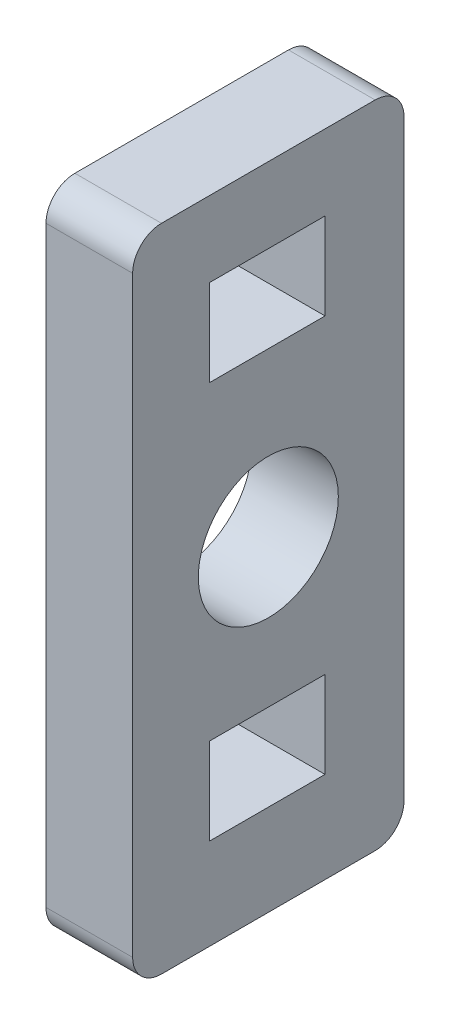
ISO-10303-21;
HEADER;
FILE_DESCRIPTION(('STEP AP214'),'2;1');
FILE_NAME('part.step','',(''),(''),'','','');
FILE_SCHEMA(('AUTOMOTIVE_DESIGN { 1 0 10303 214 1 1 1 1 }'));
ENDSEC;
DATA;
#1=APPLICATION_CONTEXT('core data for automotive mechanical design processes');
#2=APPLICATION_PROTOCOL_DEFINITION('international standard','automotive_design',2000,#1);
#3=PRODUCT_CONTEXT('',#1,'mechanical');
#4=PRODUCT('Part','Part','',(#3));
#5=PRODUCT_RELATED_PRODUCT_CATEGORY('part','',(#4));
#6=PRODUCT_DEFINITION_FORMATION('','',#4);
#7=PRODUCT_DEFINITION_CONTEXT('part definition',#1,'design');
#8=PRODUCT_DEFINITION('design','',#6,#7);
#9=PRODUCT_DEFINITION_SHAPE('','',#8);
#10=(LENGTH_UNIT() NAMED_UNIT(*) SI_UNIT(.MILLI.,.METRE.));
#11=(NAMED_UNIT(*) PLANE_ANGLE_UNIT() SI_UNIT($,.RADIAN.));
#12=(NAMED_UNIT(*) SI_UNIT($,.STERADIAN.) SOLID_ANGLE_UNIT());
#13=UNCERTAINTY_MEASURE_WITH_UNIT(LENGTH_MEASURE(1.E-05),#10,'distance_accuracy_value','');
#14=(GEOMETRIC_REPRESENTATION_CONTEXT(3) GLOBAL_UNCERTAINTY_ASSIGNED_CONTEXT((#13)) GLOBAL_UNIT_ASSIGNED_CONTEXT((#10,
#11,#12)) REPRESENTATION_CONTEXT('',''));
#15=CARTESIAN_POINT('',(0.,0.,0.));
#16=DIRECTION('',(0.,0.,1.));
#17=DIRECTION('',(1.,0.,0.));
#18=AXIS2_PLACEMENT_3D('',#15,#16,#17);
#19=CARTESIAN_POINT('',(3.,0.,0.));
#20=DIRECTION('',(1.,0.,0.));
#21=DIRECTION('',(0.,0.,-1.));
#22=AXIS2_PLACEMENT_3D('',#19,#20,#21);
#23=PLANE('',#22);
#24=DIRECTION('',(0.,-1.,0.));
#25=VECTOR('',#24,1.);
#26=CARTESIAN_POINT('',(3.,8.33189520914669,2.31570271710662));
#27=LINE('',#26,#25);
#28=CARTESIAN_POINT('',(3.,8.33189520914669,2.31570271710662));
#29=VERTEX_POINT('',#28);
#30=CARTESIAN_POINT('',(3.,5.33189520914669,2.31570271710662));
#31=VERTEX_POINT('',#30);
#32=EDGE_CURVE('E169',#29,#31,#27,.T.);
#33=ORIENTED_EDGE('',*,*,#32,.F.);
#34=DIRECTION('',(0.,0.,1.));
#35=VECTOR('',#34,1.);
#36=CARTESIAN_POINT('',(3.,8.33189520914669,-1.68429728289337));
#37=LINE('',#36,#35);
#38=CARTESIAN_POINT('',(3.,8.33189520914669,-1.68429728289337));
#39=VERTEX_POINT('',#38);
#40=EDGE_CURVE('E158',#39,#29,#37,.T.);
#41=ORIENTED_EDGE('',*,*,#40,.F.);
#42=DIRECTION('',(0.,1.,0.));
#43=VECTOR('',#42,1.);
#44=CARTESIAN_POINT('',(3.,5.33189520914669,-1.68429728289337));
#45=LINE('',#44,#43);
#46=CARTESIAN_POINT('',(3.,5.33189520914669,-1.68429728289337));
#47=VERTEX_POINT('',#46);
#48=EDGE_CURVE('E190',#47,#39,#45,.T.);
#49=ORIENTED_EDGE('',*,*,#48,.F.);
#50=DIRECTION('',(0.,0.,-1.));
#51=VECTOR('',#50,1.);
#52=CARTESIAN_POINT('',(3.,5.33189520914669,2.31570271710662));
#53=LINE('',#52,#51);
#54=EDGE_CURVE('E184',#31,#47,#53,.T.);
#55=ORIENTED_EDGE('',*,*,#54,.F.);
#56=EDGE_LOOP('',(#33,#41,#49,#55));
#57=FACE_BOUND('',#56,.T.);
#58=DIRECTION('',(0.,0.,-1.));
#59=VECTOR('',#58,1.);
#60=CARTESIAN_POINT('',(3.,-8.41810479085331,-1.68429728289337));
#61=LINE('',#60,#59);
#62=CARTESIAN_POINT('',(3.,-8.41810479085331,2.31570271710662));
#63=VERTEX_POINT('',#62);
#64=CARTESIAN_POINT('',(3.,-8.41810479085331,-1.68429728289337));
#65=VERTEX_POINT('',#64);
#66=EDGE_CURVE('E219',#63,#65,#61,.T.);
#67=ORIENTED_EDGE('',*,*,#66,.F.);
#68=DIRECTION('',(0.,-1.,0.));
#69=VECTOR('',#68,1.);
#70=CARTESIAN_POINT('',(3.,-8.41810479085331,2.31570271710662));
#71=LINE('',#70,#69);
#72=CARTESIAN_POINT('',(3.,-5.41810479085331,2.31570271710662));
#73=VERTEX_POINT('',#72);
#74=EDGE_CURVE('E216',#73,#63,#71,.T.);
#75=ORIENTED_EDGE('',*,*,#74,.F.);
#76=DIRECTION('',(0.,0.,1.));
#77=VECTOR('',#76,1.);
#78=CARTESIAN_POINT('',(3.,-5.41810479085331,2.31570271710662));
#79=LINE('',#78,#77);
#80=CARTESIAN_POINT('',(3.,-5.41810479085331,-1.68429728289337));
#81=VERTEX_POINT('',#80);
#82=EDGE_CURVE('E226',#81,#73,#79,.T.);
#83=ORIENTED_EDGE('',*,*,#82,.F.);
#84=DIRECTION('',(0.,1.,0.));
#85=VECTOR('',#84,1.);
#86=CARTESIAN_POINT('',(3.,-5.41810479085331,-1.68429728289337));
#87=LINE('',#86,#85);
#88=EDGE_CURVE('E222',#65,#81,#87,.T.);
#89=ORIENTED_EDGE('',*,*,#88,.F.);
#90=EDGE_LOOP('',(#67,#75,#83,#89));
#91=FACE_BOUND('',#90,.T.);
#92=DIRECTION('',(0.,-1.,0.));
#93=VECTOR('',#92,1.);
#94=CARTESIAN_POINT('',(3.,10.9428978998124,4.9795524748473));
#95=LINE('',#94,#93);
#96=CARTESIAN_POINT('',(3.,9.94289789981243,4.9795524748473));
#97=VERTEX_POINT('',#96);
#98=CARTESIAN_POINT('',(3.,-10.5748078263252,4.9795524748473));
#99=VERTEX_POINT('',#98);
#100=EDGE_CURVE('E258',#97,#99,#95,.T.);
#101=ORIENTED_EDGE('',*,*,#100,.T.);
#102=CARTESIAN_POINT('',(3.,-10.5748078263252,3.9795524748473));
#103=DIRECTION('',(1.,0.,0.));
#104=DIRECTION('',(0.,0.,-1.));
#105=AXIS2_PLACEMENT_3D('',#102,#103,#104);
#106=CIRCLE('',#105,1.);
#107=CARTESIAN_POINT('',(3.,-11.5748078263252,3.9795524748473));
#108=VERTEX_POINT('',#107);
#109=EDGE_CURVE('E319',#99,#108,#106,.T.);
#110=ORIENTED_EDGE('',*,*,#109,.T.);
#111=DIRECTION('',(0.,0.,-1.));
#112=VECTOR('',#111,1.);
#113=CARTESIAN_POINT('',(3.,-11.5748078263252,4.9795524748473));
#114=LINE('',#113,#112);
#115=CARTESIAN_POINT('',(3.,-11.5748078263252,-3.41828576379294));
#116=VERTEX_POINT('',#115);
#117=EDGE_CURVE('E262',#108,#116,#114,.T.);
#118=ORIENTED_EDGE('',*,*,#117,.T.);
#119=CARTESIAN_POINT('',(3.,-10.5748078263252,-3.41828576379294));
#120=DIRECTION('',(1.,0.,0.));
#121=DIRECTION('',(0.,0.,-1.));
#122=AXIS2_PLACEMENT_3D('',#119,#120,#121);
#123=CIRCLE('',#122,1.);
#124=CARTESIAN_POINT('',(3.,-10.5748078263252,-4.41828576379294));
#125=VERTEX_POINT('',#124);
#126=EDGE_CURVE('E316',#116,#125,#123,.T.);
#127=ORIENTED_EDGE('',*,*,#126,.T.);
#128=DIRECTION('',(0.,1.,0.));
#129=VECTOR('',#128,1.);
#130=CARTESIAN_POINT('',(3.,10.9428978998124,-4.41828576379294));
#131=LINE('',#130,#129);
#132=CARTESIAN_POINT('',(3.,9.94289789981243,-4.41828576379294));
#133=VERTEX_POINT('',#132);
#134=EDGE_CURVE('E267',#125,#133,#131,.T.);
#135=ORIENTED_EDGE('',*,*,#134,.T.);
#136=CARTESIAN_POINT('',(3.,9.94289789981243,-3.41828576379294));
#137=DIRECTION('',(1.,0.,0.));
#138=DIRECTION('',(0.,0.,-1.));
#139=AXIS2_PLACEMENT_3D('',#136,#137,#138);
#140=CIRCLE('',#139,1.);
#141=CARTESIAN_POINT('',(3.,10.9428978998124,-3.41828576379294));
#142=VERTEX_POINT('',#141);
#143=EDGE_CURVE('E64',#133,#142,#140,.T.);
#144=ORIENTED_EDGE('',*,*,#143,.T.);
#145=DIRECTION('',(0.,0.,1.));
#146=VECTOR('',#145,1.);
#147=CARTESIAN_POINT('',(3.,10.9428978998124,4.9795524748473));
#148=LINE('',#147,#146);
#149=CARTESIAN_POINT('',(3.,10.9428978998124,3.9795524748473));
#150=VERTEX_POINT('',#149);
#151=EDGE_CURVE('E270',#142,#150,#148,.T.);
#152=ORIENTED_EDGE('',*,*,#151,.T.);
#153=CARTESIAN_POINT('',(3.,9.94289789981243,3.9795524748473));
#154=DIRECTION('',(1.,0.,0.));
#155=DIRECTION('',(0.,0.,-1.));
#156=AXIS2_PLACEMENT_3D('',#153,#154,#155);
#157=CIRCLE('',#156,1.);
#158=EDGE_CURVE('E313',#150,#97,#157,.T.);
#159=ORIENTED_EDGE('',*,*,#158,.T.);
#160=EDGE_LOOP('',(#101,#110,#118,#127,#135,#144,#152,#159));
#161=FACE_BOUND('',#160,.T.);
#162=CARTESIAN_POINT('',(3.,-0.315954963256379,0.280633355527179));
#163=DIRECTION('',(1.,0.,0.));
#164=DIRECTION('',(0.,0.,-1.));
#165=AXIS2_PLACEMENT_3D('',#162,#163,#164);
#166=CIRCLE('',#165,2.425);
#167=CARTESIAN_POINT('',(3.,-0.315954963256379,-2.14436664447282));
#168=VERTEX_POINT('',#167);
#169=EDGE_CURVE('E199',#168,#168,#166,.T.);
#170=ORIENTED_EDGE('',*,*,#169,.F.);
#171=EDGE_LOOP('',(#170));
#172=FACE_BOUND('',#171,.T.);
#173=ADVANCED_FACE('F43',(#57,#91,#161,#172),#23,.T.);
#174=CARTESIAN_POINT('',(0.,0.,0.));
#175=DIRECTION('',(1.,0.,0.));
#176=DIRECTION('',(0.,0.,-1.));
#177=AXIS2_PLACEMENT_3D('',#174,#175,#176);
#178=PLANE('',#177);
#179=DIRECTION('',(0.,-1.,0.));
#180=VECTOR('',#179,1.);
#181=CARTESIAN_POINT('',(0.,-8.41810479085331,2.31570271710662));
#182=LINE('',#181,#180);
#183=CARTESIAN_POINT('',(0.,-5.41810479085331,2.31570271710662));
#184=VERTEX_POINT('',#183);
#185=CARTESIAN_POINT('',(0.,-8.41810479085331,2.31570271710662));
#186=VERTEX_POINT('',#185);
#187=EDGE_CURVE('E178',#184,#186,#182,.T.);
#188=ORIENTED_EDGE('',*,*,#187,.T.);
#189=DIRECTION('',(0.,0.,-1.));
#190=VECTOR('',#189,1.);
#191=CARTESIAN_POINT('',(0.,-8.41810479085331,-1.68429728289337));
#192=LINE('',#191,#190);
#193=CARTESIAN_POINT('',(0.,-8.41810479085331,-1.68429728289337));
#194=VERTEX_POINT('',#193);
#195=EDGE_CURVE('E233',#186,#194,#192,.T.);
#196=ORIENTED_EDGE('',*,*,#195,.T.);
#197=DIRECTION('',(0.,1.,0.));
#198=VECTOR('',#197,1.);
#199=CARTESIAN_POINT('',(0.,-5.41810479085331,-1.68429728289337));
#200=LINE('',#199,#198);
#201=CARTESIAN_POINT('',(0.,-5.41810479085331,-1.68429728289337));
#202=VERTEX_POINT('',#201);
#203=EDGE_CURVE('E237',#194,#202,#200,.T.);
#204=ORIENTED_EDGE('',*,*,#203,.T.);
#205=DIRECTION('',(0.,0.,1.));
#206=VECTOR('',#205,1.);
#207=CARTESIAN_POINT('',(0.,-5.41810479085331,2.31570271710662));
#208=LINE('',#207,#206);
#209=EDGE_CURVE('E220',#202,#184,#208,.T.);
#210=ORIENTED_EDGE('',*,*,#209,.T.);
#211=EDGE_LOOP('',(#188,#196,#204,#210));
#212=FACE_BOUND('',#211,.T.);
#213=DIRECTION('',(0.,0.,-1.));
#214=VECTOR('',#213,1.);
#215=CARTESIAN_POINT('',(0.,-11.5748078263252,4.9795524748473));
#216=LINE('',#215,#214);
#217=CARTESIAN_POINT('',(0.,-11.5748078263252,3.9795524748473));
#218=VERTEX_POINT('',#217);
#219=CARTESIAN_POINT('',(0.,-11.5748078263252,-3.41828576379294));
#220=VERTEX_POINT('',#219);
#221=EDGE_CURVE('E277',#218,#220,#216,.T.);
#222=ORIENTED_EDGE('',*,*,#221,.F.);
#223=CARTESIAN_POINT('',(0.,-10.5748078263252,3.9795524748473));
#224=DIRECTION('',(1.,0.,0.));
#225=DIRECTION('',(0.,0.,-1.));
#226=AXIS2_PLACEMENT_3D('',#223,#224,#225);
#227=CIRCLE('',#226,1.);
#228=CARTESIAN_POINT('',(0.,-10.5748078263252,4.9795524748473));
#229=VERTEX_POINT('',#228);
#230=EDGE_CURVE('E301',#218,#229,#227,.F.);
#231=ORIENTED_EDGE('',*,*,#230,.T.);
#232=DIRECTION('',(0.,-1.,0.));
#233=VECTOR('',#232,1.);
#234=CARTESIAN_POINT('',(0.,10.9428978998124,4.9795524748473));
#235=LINE('',#234,#233);
#236=CARTESIAN_POINT('',(0.,9.94289789981243,4.9795524748473));
#237=VERTEX_POINT('',#236);
#238=EDGE_CURVE('E257',#237,#229,#235,.T.);
#239=ORIENTED_EDGE('',*,*,#238,.F.);
#240=CARTESIAN_POINT('',(0.,9.94289789981243,3.9795524748473));
#241=DIRECTION('',(1.,0.,0.));
#242=DIRECTION('',(0.,0.,-1.));
#243=AXIS2_PLACEMENT_3D('',#240,#241,#242);
#244=CIRCLE('',#243,1.);
#245=CARTESIAN_POINT('',(0.,10.9428978998124,3.9795524748473));
#246=VERTEX_POINT('',#245);
#247=EDGE_CURVE('E295',#237,#246,#244,.F.);
#248=ORIENTED_EDGE('',*,*,#247,.T.);
#249=DIRECTION('',(0.,0.,1.));
#250=VECTOR('',#249,1.);
#251=CARTESIAN_POINT('',(0.,10.9428978998124,4.9795524748473));
#252=LINE('',#251,#250);
#253=CARTESIAN_POINT('',(0.,10.9428978998124,-3.41828576379294));
#254=VERTEX_POINT('',#253);
#255=EDGE_CURVE('E263',#254,#246,#252,.T.);
#256=ORIENTED_EDGE('',*,*,#255,.F.);
#257=CARTESIAN_POINT('',(0.,9.94289789981243,-3.41828576379294));
#258=DIRECTION('',(1.,0.,0.));
#259=DIRECTION('',(0.,0.,-1.));
#260=AXIS2_PLACEMENT_3D('',#257,#258,#259);
#261=CIRCLE('',#260,1.);
#262=CARTESIAN_POINT('',(0.,9.94289789981243,-4.41828576379294));
#263=VERTEX_POINT('',#262);
#264=EDGE_CURVE('E292',#254,#263,#261,.F.);
#265=ORIENTED_EDGE('',*,*,#264,.T.);
#266=DIRECTION('',(0.,1.,0.));
#267=VECTOR('',#266,1.);
#268=CARTESIAN_POINT('',(0.,10.9428978998124,-4.41828576379294));
#269=LINE('',#268,#267);
#270=CARTESIAN_POINT('',(0.,-10.5748078263252,-4.41828576379294));
#271=VERTEX_POINT('',#270);
#272=EDGE_CURVE('E281',#271,#263,#269,.T.);
#273=ORIENTED_EDGE('',*,*,#272,.F.);
#274=CARTESIAN_POINT('',(0.,-10.5748078263252,-3.41828576379294));
#275=DIRECTION('',(1.,0.,0.));
#276=DIRECTION('',(0.,0.,-1.));
#277=AXIS2_PLACEMENT_3D('',#274,#275,#276);
#278=CIRCLE('',#277,1.);
#279=EDGE_CURVE('E298',#271,#220,#278,.F.);
#280=ORIENTED_EDGE('',*,*,#279,.T.);
#281=EDGE_LOOP('',(#222,#231,#239,#248,#256,#265,#273,#280));
#282=FACE_BOUND('',#281,.T.);
#283=DIRECTION('',(0.,0.,1.));
#284=VECTOR('',#283,1.);
#285=CARTESIAN_POINT('',(0.,8.33189520914669,-1.68429728289337));
#286=LINE('',#285,#284);
#287=CARTESIAN_POINT('',(0.,8.33189520914669,-1.68429728289337));
#288=VERTEX_POINT('',#287);
#289=CARTESIAN_POINT('',(0.,8.33189520914669,2.31570271710662));
#290=VERTEX_POINT('',#289);
#291=EDGE_CURVE('E196',#288,#290,#286,.T.);
#292=ORIENTED_EDGE('',*,*,#291,.T.);
#293=DIRECTION('',(0.,-1.,0.));
#294=VECTOR('',#293,1.);
#295=CARTESIAN_POINT('',(0.,8.33189520914669,2.31570271710662));
#296=LINE('',#295,#294);
#297=CARTESIAN_POINT('',(0.,5.33189520914669,2.31570271710662));
#298=VERTEX_POINT('',#297);
#299=EDGE_CURVE('E176',#290,#298,#296,.T.);
#300=ORIENTED_EDGE('',*,*,#299,.T.);
#301=DIRECTION('',(0.,0.,-1.));
#302=VECTOR('',#301,1.);
#303=CARTESIAN_POINT('',(0.,5.33189520914669,2.31570271710662));
#304=LINE('',#303,#302);
#305=CARTESIAN_POINT('',(0.,5.33189520914669,-1.68429728289337));
#306=VERTEX_POINT('',#305);
#307=EDGE_CURVE('E202',#298,#306,#304,.T.);
#308=ORIENTED_EDGE('',*,*,#307,.T.);
#309=DIRECTION('',(0.,1.,0.));
#310=VECTOR('',#309,1.);
#311=CARTESIAN_POINT('',(0.,5.33189520914669,-1.68429728289337));
#312=LINE('',#311,#310);
#313=EDGE_CURVE('E170',#306,#288,#312,.T.);
#314=ORIENTED_EDGE('',*,*,#313,.T.);
#315=EDGE_LOOP('',(#292,#300,#308,#314));
#316=FACE_BOUND('',#315,.T.);
#317=CARTESIAN_POINT('',(0.,-0.315954963256379,0.280633355527179));
#318=DIRECTION('',(1.,0.,0.));
#319=DIRECTION('',(0.,0.,-1.));
#320=AXIS2_PLACEMENT_3D('',#317,#318,#319);
#321=CIRCLE('',#320,2.425);
#322=CARTESIAN_POINT('',(0.,-0.315954963256379,-2.14436664447282));
#323=VERTEX_POINT('',#322);
#324=EDGE_CURVE('E564',#323,#323,#321,.T.);
#325=ORIENTED_EDGE('',*,*,#324,.T.);
#326=EDGE_LOOP('',(#325));
#327=FACE_BOUND('',#326,.T.);
#328=ADVANCED_FACE('F337',(#212,#282,#316,#327),#178,.F.);
#329=CARTESIAN_POINT('',(3.,10.9428978998124,4.9795524748473));
#330=DIRECTION('',(0.,0.,-1.));
#331=DIRECTION('',(-1.,0.,0.));
#332=AXIS2_PLACEMENT_3D('',#329,#330,#331);
#333=PLANE('',#332);
#334=ORIENTED_EDGE('',*,*,#238,.T.);
#335=DIRECTION('',(-1.,0.,0.));
#336=VECTOR('',#335,1.);
#337=CARTESIAN_POINT('',(3.,-10.5748078263252,4.9795524748473));
#338=LINE('',#337,#336);
#339=EDGE_CURVE('E308',#229,#99,#338,.F.);
#340=ORIENTED_EDGE('',*,*,#339,.T.);
#341=ORIENTED_EDGE('',*,*,#100,.F.);
#342=DIRECTION('',(-1.,0.,0.));
#343=VECTOR('',#342,1.);
#344=CARTESIAN_POINT('',(3.,9.94289789981243,4.9795524748473));
#345=LINE('',#344,#343);
#346=EDGE_CURVE('E304',#97,#237,#345,.T.);
#347=ORIENTED_EDGE('',*,*,#346,.T.);
#348=EDGE_LOOP('',(#334,#340,#341,#347));
#349=FACE_BOUND('',#348,.T.);
#350=ADVANCED_FACE('F347',(#349),#333,.F.);
#351=CARTESIAN_POINT('',(3.,-11.5748078263252,4.9795524748473));
#352=DIRECTION('',(0.,1.,0.));
#353=DIRECTION('',(0.,0.,1.));
#354=AXIS2_PLACEMENT_3D('',#351,#352,#353);
#355=PLANE('',#354);
#356=ORIENTED_EDGE('',*,*,#117,.F.);
#357=DIRECTION('',(-1.,0.,0.));
#358=VECTOR('',#357,1.);
#359=CARTESIAN_POINT('',(3.,-11.5748078263252,3.9795524748473));
#360=LINE('',#359,#358);
#361=EDGE_CURVE('E288',#108,#218,#360,.T.);
#362=ORIENTED_EDGE('',*,*,#361,.T.);
#363=ORIENTED_EDGE('',*,*,#221,.T.);
#364=DIRECTION('',(-1.,0.,0.));
#365=VECTOR('',#364,1.);
#366=CARTESIAN_POINT('',(3.,-11.5748078263252,-3.41828576379294));
#367=LINE('',#366,#365);
#368=EDGE_CURVE('E273',#220,#116,#367,.F.);
#369=ORIENTED_EDGE('',*,*,#368,.T.);
#370=EDGE_LOOP('',(#356,#362,#363,#369));
#371=FACE_BOUND('',#370,.T.);
#372=ADVANCED_FACE('F356',(#371),#355,.F.);
#373=CARTESIAN_POINT('',(3.,10.9428978998124,-4.41828576379294));
#374=DIRECTION('',(0.,0.,1.));
#375=DIRECTION('',(1.,0.,0.));
#376=AXIS2_PLACEMENT_3D('',#373,#374,#375);
#377=PLANE('',#376);
#378=ORIENTED_EDGE('',*,*,#134,.F.);
#379=DIRECTION('',(-1.,0.,0.));
#380=VECTOR('',#379,1.);
#381=CARTESIAN_POINT('',(3.,-10.5748078263252,-4.41828576379294));
#382=LINE('',#381,#380);
#383=EDGE_CURVE('E325',#125,#271,#382,.T.);
#384=ORIENTED_EDGE('',*,*,#383,.T.);
#385=ORIENTED_EDGE('',*,*,#272,.T.);
#386=DIRECTION('',(-1.,0.,0.));
#387=VECTOR('',#386,1.);
#388=CARTESIAN_POINT('',(3.,9.94289789981243,-4.41828576379294));
#389=LINE('',#388,#387);
#390=EDGE_CURVE('E322',#263,#133,#389,.F.);
#391=ORIENTED_EDGE('',*,*,#390,.T.);
#392=EDGE_LOOP('',(#378,#384,#385,#391));
#393=FACE_BOUND('',#392,.T.);
#394=ADVANCED_FACE('F364',(#393),#377,.F.);
#395=CARTESIAN_POINT('',(3.,10.9428978998124,4.9795524748473));
#396=DIRECTION('',(0.,-1.,0.));
#397=DIRECTION('',(0.,0.,-1.));
#398=AXIS2_PLACEMENT_3D('',#395,#396,#397);
#399=PLANE('',#398);
#400=ORIENTED_EDGE('',*,*,#255,.T.);
#401=DIRECTION('',(-1.,0.,0.));
#402=VECTOR('',#401,1.);
#403=CARTESIAN_POINT('',(3.,10.9428978998124,3.9795524748473));
#404=LINE('',#403,#402);
#405=EDGE_CURVE('E11',#246,#150,#404,.F.);
#406=ORIENTED_EDGE('',*,*,#405,.T.);
#407=ORIENTED_EDGE('',*,*,#151,.F.);
#408=DIRECTION('',(-1.,0.,0.));
#409=VECTOR('',#408,1.);
#410=CARTESIAN_POINT('',(3.,10.9428978998124,-3.41828576379294));
#411=LINE('',#410,#409);
#412=EDGE_CURVE('E52',#142,#254,#411,.T.);
#413=ORIENTED_EDGE('',*,*,#412,.T.);
#414=EDGE_LOOP('',(#400,#406,#407,#413));
#415=FACE_BOUND('',#414,.T.);
#416=ADVANCED_FACE('F333',(#415),#399,.F.);
#417=CARTESIAN_POINT('',(3.,-8.41810479085331,2.31570271710662));
#418=DIRECTION('',(0.,0.,-1.));
#419=DIRECTION('',(-1.,0.,0.));
#420=AXIS2_PLACEMENT_3D('',#417,#418,#419);
#421=PLANE('',#420);
#422=ORIENTED_EDGE('',*,*,#187,.F.);
#423=DIRECTION('',(-1.,0.,0.));
#424=VECTOR('',#423,1.);
#425=CARTESIAN_POINT('',(3.,-5.41810479085331,2.31570271710662));
#426=LINE('',#425,#424);
#427=EDGE_CURVE('E229',#73,#184,#426,.T.);
#428=ORIENTED_EDGE('',*,*,#427,.F.);
#429=ORIENTED_EDGE('',*,*,#74,.T.);
#430=DIRECTION('',(-1.,0.,0.));
#431=VECTOR('',#430,1.);
#432=CARTESIAN_POINT('',(3.,-8.41810479085331,2.31570271710662));
#433=LINE('',#432,#431);
#434=EDGE_CURVE('E253',#63,#186,#433,.T.);
#435=ORIENTED_EDGE('',*,*,#434,.T.);
#436=EDGE_LOOP('',(#422,#428,#429,#435));
#437=FACE_BOUND('',#436,.T.);
#438=ADVANCED_FACE('F376',(#437),#421,.T.);
#439=CARTESIAN_POINT('',(3.,-8.41810479085331,-1.68429728289337));
#440=DIRECTION('',(0.,1.,0.));
#441=DIRECTION('',(0.,0.,1.));
#442=AXIS2_PLACEMENT_3D('',#439,#440,#441);
#443=PLANE('',#442);
#444=ORIENTED_EDGE('',*,*,#195,.F.);
#445=ORIENTED_EDGE('',*,*,#434,.F.);
#446=ORIENTED_EDGE('',*,*,#66,.T.);
#447=DIRECTION('',(-1.,0.,0.));
#448=VECTOR('',#447,1.);
#449=CARTESIAN_POINT('',(3.,-8.41810479085331,-1.68429728289337));
#450=LINE('',#449,#448);
#451=EDGE_CURVE('E250',#65,#194,#450,.T.);
#452=ORIENTED_EDGE('',*,*,#451,.T.);
#453=EDGE_LOOP('',(#444,#445,#446,#452));
#454=FACE_BOUND('',#453,.T.);
#455=ADVANCED_FACE('F478',(#454),#443,.T.);
#456=CARTESIAN_POINT('',(3.,-5.41810479085331,-1.68429728289337));
#457=DIRECTION('',(0.,0.,1.));
#458=DIRECTION('',(0.,-1.,0.));
#459=AXIS2_PLACEMENT_3D('',#456,#457,#458);
#460=PLANE('',#459);
#461=ORIENTED_EDGE('',*,*,#203,.F.);
#462=ORIENTED_EDGE('',*,*,#451,.F.);
#463=ORIENTED_EDGE('',*,*,#88,.T.);
#464=DIRECTION('',(-1.,0.,0.));
#465=VECTOR('',#464,1.);
#466=CARTESIAN_POINT('',(3.,-5.41810479085331,-1.68429728289337));
#467=LINE('',#466,#465);
#468=EDGE_CURVE('E247',#81,#202,#467,.T.);
#469=ORIENTED_EDGE('',*,*,#468,.T.);
#470=EDGE_LOOP('',(#461,#462,#463,#469));
#471=FACE_BOUND('',#470,.T.);
#472=ADVANCED_FACE('F468',(#471),#460,.T.);
#473=CARTESIAN_POINT('',(3.,-5.41810479085331,2.31570271710662));
#474=DIRECTION('',(0.,-1.,0.));
#475=DIRECTION('',(0.,0.,-1.));
#476=AXIS2_PLACEMENT_3D('',#473,#474,#475);
#477=PLANE('',#476);
#478=ORIENTED_EDGE('',*,*,#209,.F.);
#479=ORIENTED_EDGE('',*,*,#468,.F.);
#480=ORIENTED_EDGE('',*,*,#82,.T.);
#481=ORIENTED_EDGE('',*,*,#427,.T.);
#482=EDGE_LOOP('',(#478,#479,#480,#481));
#483=FACE_BOUND('',#482,.T.);
#484=ADVANCED_FACE('F459',(#483),#477,.T.);
#485=CARTESIAN_POINT('',(3.,8.33189520914669,-1.68429728289337));
#486=DIRECTION('',(0.,-1.,0.));
#487=DIRECTION('',(0.,0.,-1.));
#488=AXIS2_PLACEMENT_3D('',#485,#486,#487);
#489=PLANE('',#488);
#490=ORIENTED_EDGE('',*,*,#291,.F.);
#491=DIRECTION('',(-1.,0.,0.));
#492=VECTOR('',#491,1.);
#493=CARTESIAN_POINT('',(3.,8.33189520914669,-1.68429728289337));
#494=LINE('',#493,#492);
#495=EDGE_CURVE('E164',#39,#288,#494,.T.);
#496=ORIENTED_EDGE('',*,*,#495,.F.);
#497=ORIENTED_EDGE('',*,*,#40,.T.);
#498=DIRECTION('',(-1.,0.,0.));
#499=VECTOR('',#498,1.);
#500=CARTESIAN_POINT('',(3.,8.33189520914669,2.31570271710662));
#501=LINE('',#500,#499);
#502=EDGE_CURVE('E161',#29,#290,#501,.T.);
#503=ORIENTED_EDGE('',*,*,#502,.T.);
#504=EDGE_LOOP('',(#490,#496,#497,#503));
#505=FACE_BOUND('',#504,.T.);
#506=ADVANCED_FACE('F160',(#505),#489,.T.);
#507=CARTESIAN_POINT('',(3.,8.33189520914669,2.31570271710662));
#508=DIRECTION('',(0.,0.,-1.));
#509=DIRECTION('',(-1.,0.,0.));
#510=AXIS2_PLACEMENT_3D('',#507,#508,#509);
#511=PLANE('',#510);
#512=ORIENTED_EDGE('',*,*,#299,.F.);
#513=ORIENTED_EDGE('',*,*,#502,.F.);
#514=ORIENTED_EDGE('',*,*,#32,.T.);
#515=DIRECTION('',(-1.,0.,0.));
#516=VECTOR('',#515,1.);
#517=CARTESIAN_POINT('',(3.,5.33189520914669,2.31570271710662));
#518=LINE('',#517,#516);
#519=EDGE_CURVE('E179',#31,#298,#518,.T.);
#520=ORIENTED_EDGE('',*,*,#519,.T.);
#521=EDGE_LOOP('',(#512,#513,#514,#520));
#522=FACE_BOUND('',#521,.T.);
#523=ADVANCED_FACE('F173',(#522),#511,.T.);
#524=CARTESIAN_POINT('',(3.,5.33189520914669,2.31570271710662));
#525=DIRECTION('',(0.,1.,0.));
#526=DIRECTION('',(0.,0.,1.));
#527=AXIS2_PLACEMENT_3D('',#524,#525,#526);
#528=PLANE('',#527);
#529=ORIENTED_EDGE('',*,*,#307,.F.);
#530=ORIENTED_EDGE('',*,*,#519,.F.);
#531=ORIENTED_EDGE('',*,*,#54,.T.);
#532=DIRECTION('',(-1.,0.,0.));
#533=VECTOR('',#532,1.);
#534=CARTESIAN_POINT('',(3.,5.33189520914669,-1.68429728289337));
#535=LINE('',#534,#533);
#536=EDGE_CURVE('E211',#47,#306,#535,.T.);
#537=ORIENTED_EDGE('',*,*,#536,.T.);
#538=EDGE_LOOP('',(#529,#530,#531,#537));
#539=FACE_BOUND('',#538,.T.);
#540=ADVANCED_FACE('F432',(#539),#528,.T.);
#541=CARTESIAN_POINT('',(3.,5.33189520914669,-1.68429728289337));
#542=DIRECTION('',(0.,0.,1.));
#543=DIRECTION('',(1.,0.,0.));
#544=AXIS2_PLACEMENT_3D('',#541,#542,#543);
#545=PLANE('',#544);
#546=ORIENTED_EDGE('',*,*,#313,.F.);
#547=ORIENTED_EDGE('',*,*,#536,.F.);
#548=ORIENTED_EDGE('',*,*,#48,.T.);
#549=ORIENTED_EDGE('',*,*,#495,.T.);
#550=EDGE_LOOP('',(#546,#547,#548,#549));
#551=FACE_BOUND('',#550,.T.);
#552=ADVANCED_FACE('F422',(#551),#545,.T.);
#553=CARTESIAN_POINT('',(3.,-0.315954963256379,0.280633355527179));
#554=DIRECTION('',(-1.,0.,0.));
#555=DIRECTION('',(0.,0.,1.));
#556=AXIS2_PLACEMENT_3D('',#553,#554,#555);
#557=CYLINDRICAL_SURFACE('',#556,2.425);
#558=ORIENTED_EDGE('',*,*,#169,.T.);
#559=EDGE_LOOP('',(#558));
#560=FACE_BOUND('',#559,.T.);
#561=ORIENTED_EDGE('',*,*,#324,.F.);
#562=EDGE_LOOP('',(#561));
#563=FACE_BOUND('',#562,.T.);
#564=ADVANCED_FACE('F389',(#560,#563),#557,.F.);
#565=CARTESIAN_POINT('',(3.,-10.5748078263252,3.9795524748473));
#566=DIRECTION('',(-1.,0.,0.));
#567=DIRECTION('',(0.,0.,1.));
#568=AXIS2_PLACEMENT_3D('',#565,#566,#567);
#569=CYLINDRICAL_SURFACE('',#568,1.);
#570=ORIENTED_EDGE('',*,*,#109,.F.);
#571=ORIENTED_EDGE('',*,*,#339,.F.);
#572=ORIENTED_EDGE('',*,*,#230,.F.);
#573=ORIENTED_EDGE('',*,*,#361,.F.);
#574=EDGE_LOOP('',(#570,#571,#572,#573));
#575=FACE_BOUND('',#574,.T.);
#576=ADVANCED_FACE('F354',(#575),#569,.T.);
#577=CARTESIAN_POINT('',(3.,-10.5748078263252,-3.41828576379294));
#578=DIRECTION('',(-1.,0.,0.));
#579=DIRECTION('',(0.,0.,1.));
#580=AXIS2_PLACEMENT_3D('',#577,#578,#579);
#581=CYLINDRICAL_SURFACE('',#580,1.);
#582=ORIENTED_EDGE('',*,*,#126,.F.);
#583=ORIENTED_EDGE('',*,*,#368,.F.);
#584=ORIENTED_EDGE('',*,*,#279,.F.);
#585=ORIENTED_EDGE('',*,*,#383,.F.);
#586=EDGE_LOOP('',(#582,#583,#584,#585));
#587=FACE_BOUND('',#586,.T.);
#588=ADVANCED_FACE('F361',(#587),#581,.T.);
#589=CARTESIAN_POINT('',(3.,9.94289789981243,3.9795524748473));
#590=DIRECTION('',(-1.,0.,0.));
#591=DIRECTION('',(0.,0.,1.));
#592=AXIS2_PLACEMENT_3D('',#589,#590,#591);
#593=CYLINDRICAL_SURFACE('',#592,1.);
#594=ORIENTED_EDGE('',*,*,#158,.F.);
#595=ORIENTED_EDGE('',*,*,#405,.F.);
#596=ORIENTED_EDGE('',*,*,#247,.F.);
#597=ORIENTED_EDGE('',*,*,#346,.F.);
#598=EDGE_LOOP('',(#594,#595,#596,#597));
#599=FACE_BOUND('',#598,.T.);
#600=ADVANCED_FACE('F344',(#599),#593,.T.);
#601=CARTESIAN_POINT('',(3.,9.94289789981243,-3.41828576379294));
#602=DIRECTION('',(-1.,0.,0.));
#603=DIRECTION('',(0.,0.,1.));
#604=AXIS2_PLACEMENT_3D('',#601,#602,#603);
#605=CYLINDRICAL_SURFACE('',#604,1.);
#606=ORIENTED_EDGE('',*,*,#143,.F.);
#607=ORIENTED_EDGE('',*,*,#390,.F.);
#608=ORIENTED_EDGE('',*,*,#264,.F.);
#609=ORIENTED_EDGE('',*,*,#412,.F.);
#610=EDGE_LOOP('',(#606,#607,#608,#609));
#611=FACE_BOUND('',#610,.T.);
#612=ADVANCED_FACE('F45',(#611),#605,.T.);
#613=CLOSED_SHELL('',(#173,#328,#350,#372,#394,#416,#438,#455,#472,#484,#506,#523,#540,#552,
#564,#576,#588,#600,#612));
#614=MANIFOLD_SOLID_BREP('B2',#613);
#615=ADVANCED_BREP_SHAPE_REPRESENTATION('',(#18,#614),#14);
#616=SHAPE_DEFINITION_REPRESENTATION(#9,#615);
ENDSEC;
END-ISO-10303-21;
